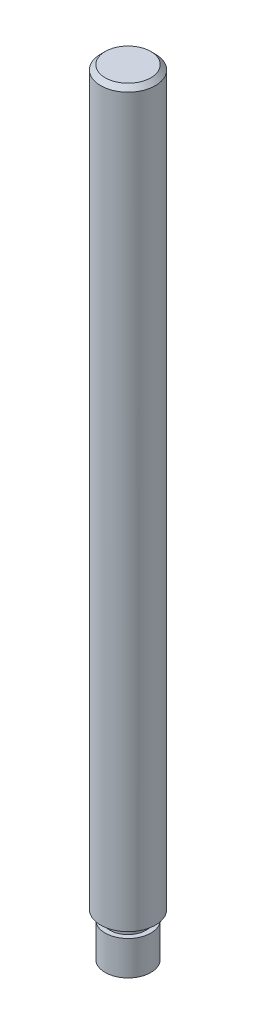
ISO-10303-21;
HEADER;
FILE_DESCRIPTION(('STEP AP214'),'2;1');
FILE_NAME('part.step','',(''),(''),'','','');
FILE_SCHEMA(('AUTOMOTIVE_DESIGN { 1 0 10303 214 1 1 1 1 }'));
ENDSEC;
DATA;
#1=APPLICATION_CONTEXT('core data for automotive mechanical design processes');
#2=APPLICATION_PROTOCOL_DEFINITION('international standard','automotive_design',2000,#1);
#3=PRODUCT_CONTEXT('',#1,'mechanical');
#4=PRODUCT('Part','Part','',(#3));
#5=PRODUCT_RELATED_PRODUCT_CATEGORY('part','',(#4));
#6=PRODUCT_DEFINITION_FORMATION('','',#4);
#7=PRODUCT_DEFINITION_CONTEXT('part definition',#1,'design');
#8=PRODUCT_DEFINITION('design','',#6,#7);
#9=PRODUCT_DEFINITION_SHAPE('','',#8);
#10=(LENGTH_UNIT() NAMED_UNIT(*) SI_UNIT(.MILLI.,.METRE.));
#11=(NAMED_UNIT(*) PLANE_ANGLE_UNIT() SI_UNIT($,.RADIAN.));
#12=(NAMED_UNIT(*) SI_UNIT($,.STERADIAN.) SOLID_ANGLE_UNIT());
#13=UNCERTAINTY_MEASURE_WITH_UNIT(LENGTH_MEASURE(1.E-05),#10,'distance_accuracy_value','');
#14=(GEOMETRIC_REPRESENTATION_CONTEXT(3) GLOBAL_UNCERTAINTY_ASSIGNED_CONTEXT((#13)) GLOBAL_UNIT_ASSIGNED_CONTEXT((#10,
#11,#12)) REPRESENTATION_CONTEXT('',''));
#15=CARTESIAN_POINT('',(0.,0.,0.));
#16=DIRECTION('',(0.,0.,1.));
#17=DIRECTION('',(1.,0.,0.));
#18=AXIS2_PLACEMENT_3D('',#15,#16,#17);
#19=CARTESIAN_POINT('',(0.,0.,0.));
#20=DIRECTION('',(0.,-1.,0.));
#21=DIRECTION('',(0.,0.,-1.));
#22=AXIS2_PLACEMENT_3D('',#19,#20,#21);
#23=PLANE('',#22);
#24=CARTESIAN_POINT('',(0.,0.,0.));
#25=DIRECTION('',(0.,-1.,0.));
#26=DIRECTION('',(0.,0.,-1.));
#27=AXIS2_PLACEMENT_3D('',#24,#25,#26);
#28=CIRCLE('',#27,5.);
#29=CARTESIAN_POINT('',(0.,0.,-5.));
#30=VERTEX_POINT('',#29);
#31=EDGE_CURVE('E41',#30,#30,#28,.T.);
#32=ORIENTED_EDGE('',*,*,#31,.T.);
#33=EDGE_LOOP('',(#32));
#34=FACE_BOUND('',#33,.T.);
#35=ADVANCED_FACE('F30',(#34),#23,.T.);
#36=CARTESIAN_POINT('',(0.,0.,0.));
#37=DIRECTION('',(0.,-1.,0.));
#38=DIRECTION('',(0.,0.,-1.));
#39=AXIS2_PLACEMENT_3D('',#36,#37,#38);
#40=CYLINDRICAL_SURFACE('',#39,5.);
#41=CARTESIAN_POINT('',(0.,7.5,0.));
#42=DIRECTION('',(0.,-1.,0.));
#43=DIRECTION('',(0.,0.,-1.));
#44=AXIS2_PLACEMENT_3D('',#41,#42,#43);
#45=CIRCLE('',#44,5.);
#46=CARTESIAN_POINT('',(0.,7.5,-5.));
#47=VERTEX_POINT('',#46);
#48=EDGE_CURVE('E45',#47,#47,#45,.T.);
#49=ORIENTED_EDGE('',*,*,#48,.T.);
#50=EDGE_LOOP('',(#49));
#51=FACE_BOUND('',#50,.T.);
#52=ORIENTED_EDGE('',*,*,#31,.F.);
#53=EDGE_LOOP('',(#52));
#54=FACE_BOUND('',#53,.T.);
#55=ADVANCED_FACE('F75',(#51,#54),#40,.T.);
#56=CARTESIAN_POINT('',(3.95,7.5,0.));
#57=DIRECTION('',(0.,1.,0.));
#58=DIRECTION('',(0.,0.,1.));
#59=AXIS2_PLACEMENT_3D('',#56,#57,#58);
#60=PLANE('',#59);
#61=CARTESIAN_POINT('',(0.,7.5,0.));
#62=DIRECTION('',(0.,-1.,0.));
#63=DIRECTION('',(0.,0.,-1.));
#64=AXIS2_PLACEMENT_3D('',#61,#62,#63);
#65=CIRCLE('',#64,3.95);
#66=CARTESIAN_POINT('',(0.,7.5,-3.95));
#67=VERTEX_POINT('',#66);
#68=EDGE_CURVE('E50',#67,#67,#65,.T.);
#69=ORIENTED_EDGE('',*,*,#68,.T.);
#70=EDGE_LOOP('',(#69));
#71=FACE_BOUND('',#70,.T.);
#72=ORIENTED_EDGE('',*,*,#48,.F.);
#73=EDGE_LOOP('',(#72));
#74=FACE_BOUND('',#73,.T.);
#75=ADVANCED_FACE('F80',(#71,#74),#60,.T.);
#76=CARTESIAN_POINT('',(0.,0.,0.));
#77=DIRECTION('',(0.,-1.,0.));
#78=DIRECTION('',(0.,0.,-1.));
#79=AXIS2_PLACEMENT_3D('',#76,#77,#78);
#80=CYLINDRICAL_SURFACE('',#79,3.95);
#81=CARTESIAN_POINT('',(0.,9.5,0.));
#82=DIRECTION('',(0.,-1.,0.));
#83=DIRECTION('',(0.,0.,-1.));
#84=AXIS2_PLACEMENT_3D('',#81,#82,#83);
#85=CIRCLE('',#84,3.95);
#86=CARTESIAN_POINT('',(0.,9.5,-3.95));
#87=VERTEX_POINT('',#86);
#88=EDGE_CURVE('E53',#87,#87,#85,.T.);
#89=ORIENTED_EDGE('',*,*,#88,.T.);
#90=EDGE_LOOP('',(#89));
#91=FACE_BOUND('',#90,.T.);
#92=ORIENTED_EDGE('',*,*,#68,.F.);
#93=EDGE_LOOP('',(#92));
#94=FACE_BOUND('',#93,.T.);
#95=ADVANCED_FACE('F72',(#91,#94),#80,.T.);
#96=CARTESIAN_POINT('',(3.95,9.5,0.));
#97=DIRECTION('',(0.,-1.,0.));
#98=DIRECTION('',(0.,0.,-1.));
#99=AXIS2_PLACEMENT_3D('',#96,#97,#98);
#100=PLANE('',#99);
#101=CARTESIAN_POINT('',(0.,9.5,0.));
#102=DIRECTION('',(0.,-1.,0.));
#103=DIRECTION('',(0.,0.,-1.));
#104=AXIS2_PLACEMENT_3D('',#101,#102,#103);
#105=CIRCLE('',#104,6.);
#106=CARTESIAN_POINT('',(0.,9.5,-6.));
#107=VERTEX_POINT('',#106);
#108=EDGE_CURVE('E56',#107,#107,#105,.T.);
#109=ORIENTED_EDGE('',*,*,#108,.T.);
#110=EDGE_LOOP('',(#109));
#111=FACE_BOUND('',#110,.T.);
#112=ORIENTED_EDGE('',*,*,#88,.F.);
#113=EDGE_LOOP('',(#112));
#114=FACE_BOUND('',#113,.T.);
#115=ADVANCED_FACE('F60',(#111,#114),#100,.T.);
#116=CARTESIAN_POINT('',(0.,0.,0.));
#117=DIRECTION('',(0.,-1.,0.));
#118=DIRECTION('',(0.,0.,-1.));
#119=AXIS2_PLACEMENT_3D('',#116,#117,#118);
#120=CYLINDRICAL_SURFACE('',#119,6.);
#121=CARTESIAN_POINT('',(0.,169.,0.));
#122=DIRECTION('',(0.,1.,0.));
#123=DIRECTION('',(0.,0.,1.));
#124=AXIS2_PLACEMENT_3D('',#121,#122,#123);
#125=CIRCLE('',#124,6.);
#126=CARTESIAN_POINT('',(0.,169.,6.));
#127=VERTEX_POINT('',#126);
#128=EDGE_CURVE('E37',#127,#127,#125,.F.);
#129=ORIENTED_EDGE('',*,*,#128,.T.);
#130=EDGE_LOOP('',(#129));
#131=FACE_BOUND('',#130,.T.);
#132=ORIENTED_EDGE('',*,*,#108,.F.);
#133=EDGE_LOOP('',(#132));
#134=FACE_BOUND('',#133,.T.);
#135=ADVANCED_FACE('F63',(#131,#134),#120,.T.);
#136=CARTESIAN_POINT('',(6.,170.,0.));
#137=DIRECTION('',(0.,1.,0.));
#138=DIRECTION('',(0.,0.,1.));
#139=AXIS2_PLACEMENT_3D('',#136,#137,#138);
#140=PLANE('',#139);
#141=CARTESIAN_POINT('',(0.,170.,0.));
#142=DIRECTION('',(0.,1.,0.));
#143=DIRECTION('',(0.,0.,1.));
#144=AXIS2_PLACEMENT_3D('',#141,#142,#143);
#145=CIRCLE('',#144,5.00000000000003);
#146=CARTESIAN_POINT('',(0.,170.,5.00000000000003));
#147=VERTEX_POINT('',#146);
#148=EDGE_CURVE('E10',#147,#147,#145,.T.);
#149=ORIENTED_EDGE('',*,*,#148,.T.);
#150=EDGE_LOOP('',(#149));
#151=FACE_BOUND('',#150,.T.);
#152=ADVANCED_FACE('F65',(#151),#140,.T.);
#153=CARTESIAN_POINT('',(0.,169.,0.));
#154=DIRECTION('',(0.,-1.,0.));
#155=DIRECTION('',(0.,0.,-1.));
#156=AXIS2_PLACEMENT_3D('',#153,#154,#155);
#157=CONICAL_SURFACE('',#156,6.,0.785398163397446);
#158=ORIENTED_EDGE('',*,*,#148,.F.);
#159=EDGE_LOOP('',(#158));
#160=FACE_BOUND('',#159,.T.);
#161=ORIENTED_EDGE('',*,*,#128,.F.);
#162=EDGE_LOOP('',(#161));
#163=FACE_BOUND('',#162,.T.);
#164=ADVANCED_FACE('F32',(#160,#163),#157,.T.);
#165=CLOSED_SHELL('',(#35,#55,#75,#95,#115,#135,#152,#164));
#166=MANIFOLD_SOLID_BREP('B2',#165);
#167=ADVANCED_BREP_SHAPE_REPRESENTATION('',(#18,#166),#14);
#168=SHAPE_DEFINITION_REPRESENTATION(#9,#167);
ENDSEC;
END-ISO-10303-21;
